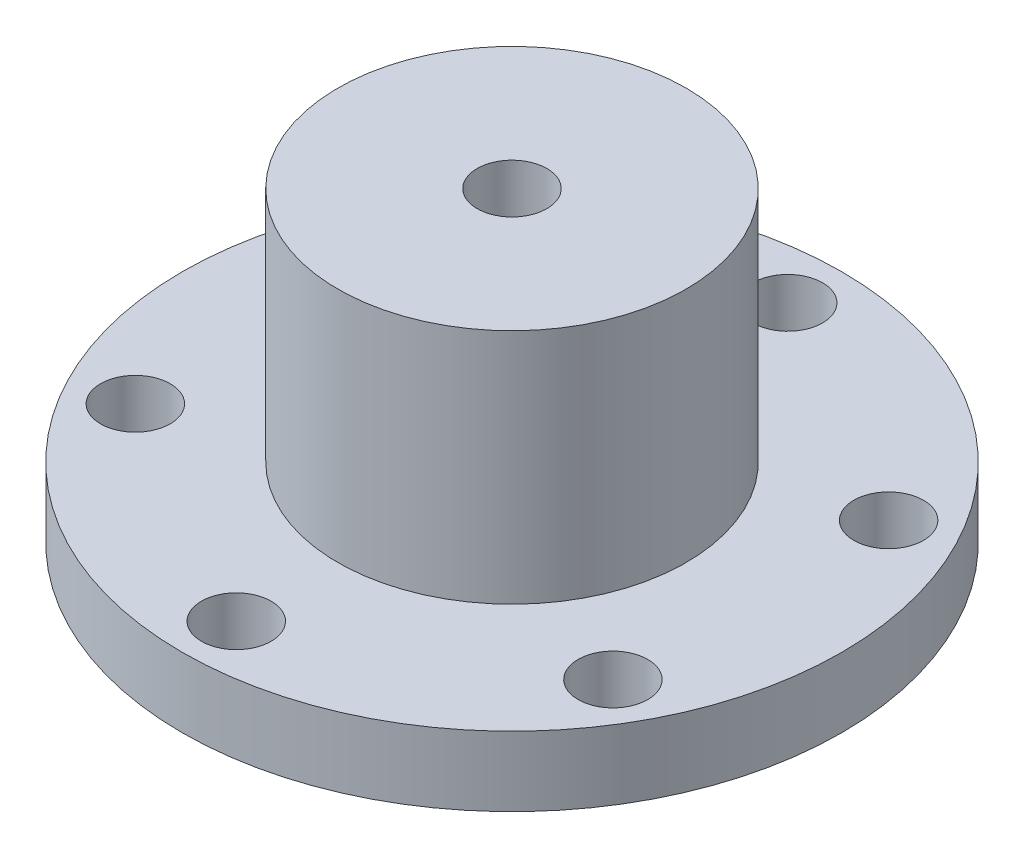
ISO-10303-21;
HEADER;
FILE_DESCRIPTION(('STEP AP214'),'2;1');
FILE_NAME('part.step','',(''),(''),'','','');
FILE_SCHEMA(('AUTOMOTIVE_DESIGN { 1 0 10303 214 1 1 1 1 }'));
ENDSEC;
DATA;
#1=APPLICATION_CONTEXT('core data for automotive mechanical design processes');
#2=APPLICATION_PROTOCOL_DEFINITION('international standard','automotive_design',2000,#1);
#3=PRODUCT_CONTEXT('',#1,'mechanical');
#4=PRODUCT('Part','Part','',(#3));
#5=PRODUCT_RELATED_PRODUCT_CATEGORY('part','',(#4));
#6=PRODUCT_DEFINITION_FORMATION('','',#4);
#7=PRODUCT_DEFINITION_CONTEXT('part definition',#1,'design');
#8=PRODUCT_DEFINITION('design','',#6,#7);
#9=PRODUCT_DEFINITION_SHAPE('','',#8);
#10=(LENGTH_UNIT() NAMED_UNIT(*) SI_UNIT(.MILLI.,.METRE.));
#11=(NAMED_UNIT(*) PLANE_ANGLE_UNIT() SI_UNIT($,.RADIAN.));
#12=(NAMED_UNIT(*) SI_UNIT($,.STERADIAN.) SOLID_ANGLE_UNIT());
#13=UNCERTAINTY_MEASURE_WITH_UNIT(LENGTH_MEASURE(1.E-05),#10,'distance_accuracy_value','');
#14=(GEOMETRIC_REPRESENTATION_CONTEXT(3) GLOBAL_UNCERTAINTY_ASSIGNED_CONTEXT((#13)) GLOBAL_UNIT_ASSIGNED_CONTEXT((#10,
#11,#12)) REPRESENTATION_CONTEXT('',''));
#15=CARTESIAN_POINT('',(0.,0.,0.));
#16=DIRECTION('',(0.,0.,1.));
#17=DIRECTION('',(1.,0.,0.));
#18=AXIS2_PLACEMENT_3D('',#15,#16,#17);
#19=CARTESIAN_POINT('',(0.,0.,0.));
#20=DIRECTION('',(0.,-1.,0.));
#21=DIRECTION('',(0.,0.,-1.));
#22=AXIS2_PLACEMENT_3D('',#19,#20,#21);
#23=CYLINDRICAL_SURFACE('',#22,3.);
#24=CARTESIAN_POINT('',(0.,26.4,0.));
#25=DIRECTION('',(0.,-1.,0.));
#26=DIRECTION('',(0.,0.,-1.));
#27=AXIS2_PLACEMENT_3D('',#24,#25,#26);
#28=CIRCLE('',#27,3.);
#29=CARTESIAN_POINT('',(0.,26.4,-3.));
#30=VERTEX_POINT('',#29);
#31=EDGE_CURVE('E61',#30,#30,#28,.T.);
#32=ORIENTED_EDGE('',*,*,#31,.F.);
#33=EDGE_LOOP('',(#32));
#34=FACE_BOUND('',#33,.T.);
#35=CARTESIAN_POINT('',(0.,0.,0.));
#36=DIRECTION('',(0.,-1.,0.));
#37=DIRECTION('',(0.,0.,-1.));
#38=AXIS2_PLACEMENT_3D('',#35,#36,#37);
#39=CIRCLE('',#38,3.);
#40=CARTESIAN_POINT('',(0.,0.,-3.));
#41=VERTEX_POINT('',#40);
#42=EDGE_CURVE('E10',#41,#41,#39,.T.);
#43=ORIENTED_EDGE('',*,*,#42,.T.);
#44=EDGE_LOOP('',(#43));
#45=FACE_BOUND('',#44,.T.);
#46=ADVANCED_FACE('F39',(#34,#45),#23,.F.);
#47=CARTESIAN_POINT('',(0.,0.,3.));
#48=DIRECTION('',(0.,1.,0.));
#49=DIRECTION('',(0.,0.,1.));
#50=AXIS2_PLACEMENT_3D('',#47,#48,#49);
#51=PLANE('',#50);
#52=CARTESIAN_POINT('',(0.,0.,-23.75));
#53=DIRECTION('',(0.,1.,0.));
#54=DIRECTION('',(0.,0.,1.));
#55=AXIS2_PLACEMENT_3D('',#52,#53,#54);
#56=CIRCLE('',#55,3.);
#57=CARTESIAN_POINT('',(0.,0.,-20.75));
#58=VERTEX_POINT('',#57);
#59=EDGE_CURVE('E64',#58,#58,#56,.T.);
#60=ORIENTED_EDGE('',*,*,#59,.T.);
#61=EDGE_LOOP('',(#60));
#62=FACE_BOUND('',#61,.T.);
#63=CARTESIAN_POINT('',(-20.5681033398804,0.,-11.875));
#64=DIRECTION('',(0.,1.,0.));
#65=DIRECTION('',(0.,0.,1.));
#66=AXIS2_PLACEMENT_3D('',#63,#64,#65);
#67=CIRCLE('',#66,3.);
#68=CARTESIAN_POINT('',(-20.5681033398804,0.,-8.87499999999998));
#69=VERTEX_POINT('',#68);
#70=EDGE_CURVE('E91',#69,#69,#67,.T.);
#71=ORIENTED_EDGE('',*,*,#70,.T.);
#72=EDGE_LOOP('',(#71));
#73=FACE_BOUND('',#72,.T.);
#74=CARTESIAN_POINT('',(-20.5681033398804,0.,11.875));
#75=DIRECTION('',(0.,1.,0.));
#76=DIRECTION('',(0.,0.,1.));
#77=AXIS2_PLACEMENT_3D('',#74,#75,#76);
#78=CIRCLE('',#77,3.);
#79=CARTESIAN_POINT('',(-20.5681033398804,0.,14.875));
#80=VERTEX_POINT('',#79);
#81=EDGE_CURVE('E65',#80,#80,#78,.T.);
#82=ORIENTED_EDGE('',*,*,#81,.T.);
#83=EDGE_LOOP('',(#82));
#84=FACE_BOUND('',#83,.T.);
#85=CARTESIAN_POINT('',(0.,0.,23.75));
#86=DIRECTION('',(0.,1.,0.));
#87=DIRECTION('',(0.,0.,1.));
#88=AXIS2_PLACEMENT_3D('',#85,#86,#87);
#89=CIRCLE('',#88,3.);
#90=CARTESIAN_POINT('',(0.,0.,26.75));
#91=VERTEX_POINT('',#90);
#92=EDGE_CURVE('E72',#91,#91,#89,.T.);
#93=ORIENTED_EDGE('',*,*,#92,.T.);
#94=EDGE_LOOP('',(#93));
#95=FACE_BOUND('',#94,.T.);
#96=CARTESIAN_POINT('',(20.5681033398804,0.,11.875));
#97=DIRECTION('',(0.,1.,0.));
#98=DIRECTION('',(0.,0.,1.));
#99=AXIS2_PLACEMENT_3D('',#96,#97,#98);
#100=CIRCLE('',#99,3.);
#101=CARTESIAN_POINT('',(20.5681033398804,0.,14.875));
#102=VERTEX_POINT('',#101);
#103=EDGE_CURVE('E78',#102,#102,#100,.T.);
#104=ORIENTED_EDGE('',*,*,#103,.T.);
#105=EDGE_LOOP('',(#104));
#106=FACE_BOUND('',#105,.T.);
#107=CARTESIAN_POINT('',(20.5681033398804,0.,-11.875));
#108=DIRECTION('',(0.,1.,0.));
#109=DIRECTION('',(0.,0.,1.));
#110=AXIS2_PLACEMENT_3D('',#107,#108,#109);
#111=CIRCLE('',#110,3.);
#112=CARTESIAN_POINT('',(20.5681033398804,0.,-8.87500000000001));
#113=VERTEX_POINT('',#112);
#114=EDGE_CURVE('E84',#113,#113,#111,.T.);
#115=ORIENTED_EDGE('',*,*,#114,.T.);
#116=EDGE_LOOP('',(#115));
#117=FACE_BOUND('',#116,.T.);
#118=ORIENTED_EDGE('',*,*,#42,.F.);
#119=EDGE_LOOP('',(#118));
#120=FACE_BOUND('',#119,.T.);
#121=CARTESIAN_POINT('',(0.,0.,0.));
#122=DIRECTION('',(0.,-1.,0.));
#123=DIRECTION('',(0.,0.,-1.));
#124=AXIS2_PLACEMENT_3D('',#121,#122,#123);
#125=CIRCLE('',#124,28.4);
#126=CARTESIAN_POINT('',(0.,0.,-28.4));
#127=VERTEX_POINT('',#126);
#128=EDGE_CURVE('E45',#127,#127,#125,.T.);
#129=ORIENTED_EDGE('',*,*,#128,.T.);
#130=EDGE_LOOP('',(#129));
#131=FACE_BOUND('',#130,.T.);
#132=ADVANCED_FACE('F101',(#62,#73,#84,#95,#106,#117,#120,#131),#51,.F.);
#133=CARTESIAN_POINT('',(0.,0.,0.));
#134=DIRECTION('',(0.,-1.,0.));
#135=DIRECTION('',(0.,0.,-1.));
#136=AXIS2_PLACEMENT_3D('',#133,#134,#135);
#137=CYLINDRICAL_SURFACE('',#136,28.4);
#138=ORIENTED_EDGE('',*,*,#128,.F.);
#139=EDGE_LOOP('',(#138));
#140=FACE_BOUND('',#139,.T.);
#141=CARTESIAN_POINT('',(0.,6.,0.));
#142=DIRECTION('',(0.,-1.,0.));
#143=DIRECTION('',(0.,0.,-1.));
#144=AXIS2_PLACEMENT_3D('',#141,#142,#143);
#145=CIRCLE('',#144,28.4);
#146=CARTESIAN_POINT('',(0.,6.,-28.4));
#147=VERTEX_POINT('',#146);
#148=EDGE_CURVE('E49',#147,#147,#145,.T.);
#149=ORIENTED_EDGE('',*,*,#148,.T.);
#150=EDGE_LOOP('',(#149));
#151=FACE_BOUND('',#150,.T.);
#152=ADVANCED_FACE('F115',(#140,#151),#137,.T.);
#153=CARTESIAN_POINT('',(0.,6.,28.4));
#154=DIRECTION('',(0.,-1.,0.));
#155=DIRECTION('',(0.,0.,-1.));
#156=AXIS2_PLACEMENT_3D('',#153,#154,#155);
#157=PLANE('',#156);
#158=CARTESIAN_POINT('',(0.,6.,-23.75));
#159=DIRECTION('',(0.,1.,0.));
#160=DIRECTION('',(0.,0.,1.));
#161=AXIS2_PLACEMENT_3D('',#158,#159,#160);
#162=CIRCLE('',#161,3.);
#163=CARTESIAN_POINT('',(0.,6.,-20.75));
#164=VERTEX_POINT('',#163);
#165=EDGE_CURVE('E90',#164,#164,#162,.T.);
#166=ORIENTED_EDGE('',*,*,#165,.F.);
#167=EDGE_LOOP('',(#166));
#168=FACE_BOUND('',#167,.T.);
#169=CARTESIAN_POINT('',(-20.5681033398804,6.,-11.875));
#170=DIRECTION('',(0.,1.,0.));
#171=DIRECTION('',(0.,0.,1.));
#172=AXIS2_PLACEMENT_3D('',#169,#170,#171);
#173=CIRCLE('',#172,3.);
#174=CARTESIAN_POINT('',(-20.5681033398804,6.,-8.87499999999998));
#175=VERTEX_POINT('',#174);
#176=EDGE_CURVE('E69',#175,#175,#173,.T.);
#177=ORIENTED_EDGE('',*,*,#176,.F.);
#178=EDGE_LOOP('',(#177));
#179=FACE_BOUND('',#178,.T.);
#180=CARTESIAN_POINT('',(-20.5681033398804,6.,11.875));
#181=DIRECTION('',(0.,1.,0.));
#182=DIRECTION('',(0.,0.,1.));
#183=AXIS2_PLACEMENT_3D('',#180,#181,#182);
#184=CIRCLE('',#183,3.);
#185=CARTESIAN_POINT('',(-20.5681033398804,6.,14.875));
#186=VERTEX_POINT('',#185);
#187=EDGE_CURVE('E68',#186,#186,#184,.T.);
#188=ORIENTED_EDGE('',*,*,#187,.F.);
#189=EDGE_LOOP('',(#188));
#190=FACE_BOUND('',#189,.T.);
#191=CARTESIAN_POINT('',(0.,6.,23.75));
#192=DIRECTION('',(0.,1.,0.));
#193=DIRECTION('',(0.,0.,1.));
#194=AXIS2_PLACEMENT_3D('',#191,#192,#193);
#195=CIRCLE('',#194,3.);
#196=CARTESIAN_POINT('',(0.,6.,26.75));
#197=VERTEX_POINT('',#196);
#198=EDGE_CURVE('E75',#197,#197,#195,.T.);
#199=ORIENTED_EDGE('',*,*,#198,.F.);
#200=EDGE_LOOP('',(#199));
#201=FACE_BOUND('',#200,.T.);
#202=CARTESIAN_POINT('',(20.5681033398804,6.,11.875));
#203=DIRECTION('',(0.,1.,0.));
#204=DIRECTION('',(0.,0.,1.));
#205=AXIS2_PLACEMENT_3D('',#202,#203,#204);
#206=CIRCLE('',#205,3.);
#207=CARTESIAN_POINT('',(20.5681033398804,6.,14.875));
#208=VERTEX_POINT('',#207);
#209=EDGE_CURVE('E81',#208,#208,#206,.T.);
#210=ORIENTED_EDGE('',*,*,#209,.F.);
#211=EDGE_LOOP('',(#210));
#212=FACE_BOUND('',#211,.T.);
#213=CARTESIAN_POINT('',(20.5681033398804,6.,-11.875));
#214=DIRECTION('',(0.,1.,0.));
#215=DIRECTION('',(0.,0.,1.));
#216=AXIS2_PLACEMENT_3D('',#213,#214,#215);
#217=CIRCLE('',#216,3.);
#218=CARTESIAN_POINT('',(20.5681033398804,6.,-8.87500000000001));
#219=VERTEX_POINT('',#218);
#220=EDGE_CURVE('E87',#219,#219,#217,.T.);
#221=ORIENTED_EDGE('',*,*,#220,.F.);
#222=EDGE_LOOP('',(#221));
#223=FACE_BOUND('',#222,.T.);
#224=ORIENTED_EDGE('',*,*,#148,.F.);
#225=EDGE_LOOP('',(#224));
#226=FACE_BOUND('',#225,.T.);
#227=CARTESIAN_POINT('',(0.,6.,0.));
#228=DIRECTION('',(0.,-1.,0.));
#229=DIRECTION('',(0.,0.,-1.));
#230=AXIS2_PLACEMENT_3D('',#227,#228,#229);
#231=CIRCLE('',#230,15.);
#232=CARTESIAN_POINT('',(0.,6.,-15.));
#233=VERTEX_POINT('',#232);
#234=EDGE_CURVE('E53',#233,#233,#231,.T.);
#235=ORIENTED_EDGE('',*,*,#234,.T.);
#236=EDGE_LOOP('',(#235));
#237=FACE_BOUND('',#236,.T.);
#238=ADVANCED_FACE('F111',(#168,#179,#190,#201,#212,#223,#226,#237),#157,.F.);
#239=CARTESIAN_POINT('',(0.,0.,0.));
#240=DIRECTION('',(0.,-1.,0.));
#241=DIRECTION('',(0.,0.,-1.));
#242=AXIS2_PLACEMENT_3D('',#239,#240,#241);
#243=CYLINDRICAL_SURFACE('',#242,15.);
#244=ORIENTED_EDGE('',*,*,#234,.F.);
#245=EDGE_LOOP('',(#244));
#246=FACE_BOUND('',#245,.T.);
#247=CARTESIAN_POINT('',(0.,26.4,0.));
#248=DIRECTION('',(0.,-1.,0.));
#249=DIRECTION('',(0.,0.,-1.));
#250=AXIS2_PLACEMENT_3D('',#247,#248,#249);
#251=CIRCLE('',#250,15.);
#252=CARTESIAN_POINT('',(0.,26.4,-15.));
#253=VERTEX_POINT('',#252);
#254=EDGE_CURVE('E58',#253,#253,#251,.T.);
#255=ORIENTED_EDGE('',*,*,#254,.T.);
#256=EDGE_LOOP('',(#255));
#257=FACE_BOUND('',#256,.T.);
#258=ADVANCED_FACE('F114',(#246,#257),#243,.T.);
#259=CARTESIAN_POINT('',(0.,26.4,15.));
#260=DIRECTION('',(0.,-1.,0.));
#261=DIRECTION('',(0.,0.,-1.));
#262=AXIS2_PLACEMENT_3D('',#259,#260,#261);
#263=PLANE('',#262);
#264=ORIENTED_EDGE('',*,*,#254,.F.);
#265=EDGE_LOOP('',(#264));
#266=FACE_BOUND('',#265,.T.);
#267=ORIENTED_EDGE('',*,*,#31,.T.);
#268=EDGE_LOOP('',(#267));
#269=FACE_BOUND('',#268,.T.);
#270=ADVANCED_FACE('F133',(#266,#269),#263,.F.);
#271=CARTESIAN_POINT('',(20.5681033398804,0.,-11.875));
#272=DIRECTION('',(0.,1.,0.));
#273=DIRECTION('',(0.,0.,1.));
#274=AXIS2_PLACEMENT_3D('',#271,#272,#273);
#275=CYLINDRICAL_SURFACE('',#274,3.);
#276=ORIENTED_EDGE('',*,*,#114,.F.);
#277=EDGE_LOOP('',(#276));
#278=FACE_BOUND('',#277,.T.);
#279=ORIENTED_EDGE('',*,*,#220,.T.);
#280=EDGE_LOOP('',(#279));
#281=FACE_BOUND('',#280,.T.);
#282=ADVANCED_FACE('F139',(#278,#281),#275,.F.);
#283=CARTESIAN_POINT('',(20.5681033398804,0.,11.875));
#284=DIRECTION('',(0.,1.,0.));
#285=DIRECTION('',(0.,0.,1.));
#286=AXIS2_PLACEMENT_3D('',#283,#284,#285);
#287=CYLINDRICAL_SURFACE('',#286,3.);
#288=ORIENTED_EDGE('',*,*,#103,.F.);
#289=EDGE_LOOP('',(#288));
#290=FACE_BOUND('',#289,.T.);
#291=ORIENTED_EDGE('',*,*,#209,.T.);
#292=EDGE_LOOP('',(#291));
#293=FACE_BOUND('',#292,.T.);
#294=ADVANCED_FACE('F160',(#290,#293),#287,.F.);
#295=CARTESIAN_POINT('',(0.,0.,23.75));
#296=DIRECTION('',(0.,1.,0.));
#297=DIRECTION('',(0.,0.,1.));
#298=AXIS2_PLACEMENT_3D('',#295,#296,#297);
#299=CYLINDRICAL_SURFACE('',#298,3.);
#300=ORIENTED_EDGE('',*,*,#92,.F.);
#301=EDGE_LOOP('',(#300));
#302=FACE_BOUND('',#301,.T.);
#303=ORIENTED_EDGE('',*,*,#198,.T.);
#304=EDGE_LOOP('',(#303));
#305=FACE_BOUND('',#304,.T.);
#306=ADVANCED_FACE('F156',(#302,#305),#299,.F.);
#307=CARTESIAN_POINT('',(-20.5681033398804,0.,11.875));
#308=DIRECTION('',(0.,1.,0.));
#309=DIRECTION('',(0.,0.,1.));
#310=AXIS2_PLACEMENT_3D('',#307,#308,#309);
#311=CYLINDRICAL_SURFACE('',#310,3.);
#312=ORIENTED_EDGE('',*,*,#81,.F.);
#313=EDGE_LOOP('',(#312));
#314=FACE_BOUND('',#313,.T.);
#315=ORIENTED_EDGE('',*,*,#187,.T.);
#316=EDGE_LOOP('',(#315));
#317=FACE_BOUND('',#316,.T.);
#318=ADVANCED_FACE('F153',(#314,#317),#311,.F.);
#319=CARTESIAN_POINT('',(-20.5681033398804,0.,-11.875));
#320=DIRECTION('',(0.,1.,0.));
#321=DIRECTION('',(0.,0.,1.));
#322=AXIS2_PLACEMENT_3D('',#319,#320,#321);
#323=CYLINDRICAL_SURFACE('',#322,3.);
#324=ORIENTED_EDGE('',*,*,#70,.F.);
#325=EDGE_LOOP('',(#324));
#326=FACE_BOUND('',#325,.T.);
#327=ORIENTED_EDGE('',*,*,#176,.T.);
#328=EDGE_LOOP('',(#327));
#329=FACE_BOUND('',#328,.T.);
#330=ADVANCED_FACE('F107',(#326,#329),#323,.F.);
#331=CARTESIAN_POINT('',(0.,0.,-23.75));
#332=DIRECTION('',(0.,1.,0.));
#333=DIRECTION('',(0.,0.,1.));
#334=AXIS2_PLACEMENT_3D('',#331,#332,#333);
#335=CYLINDRICAL_SURFACE('',#334,3.);
#336=ORIENTED_EDGE('',*,*,#59,.F.);
#337=EDGE_LOOP('',(#336));
#338=FACE_BOUND('',#337,.T.);
#339=ORIENTED_EDGE('',*,*,#165,.T.);
#340=EDGE_LOOP('',(#339));
#341=FACE_BOUND('',#340,.T.);
#342=ADVANCED_FACE('F104',(#338,#341),#335,.F.);
#343=CLOSED_SHELL('',(#46,#132,#152,#238,#258,#270,#282,#294,#306,#318,#330,#342));
#344=MANIFOLD_SOLID_BREP('B2',#343);
#345=ADVANCED_BREP_SHAPE_REPRESENTATION('',(#18,#344),#14);
#346=SHAPE_DEFINITION_REPRESENTATION(#9,#345);
ENDSEC;
END-ISO-10303-21;
